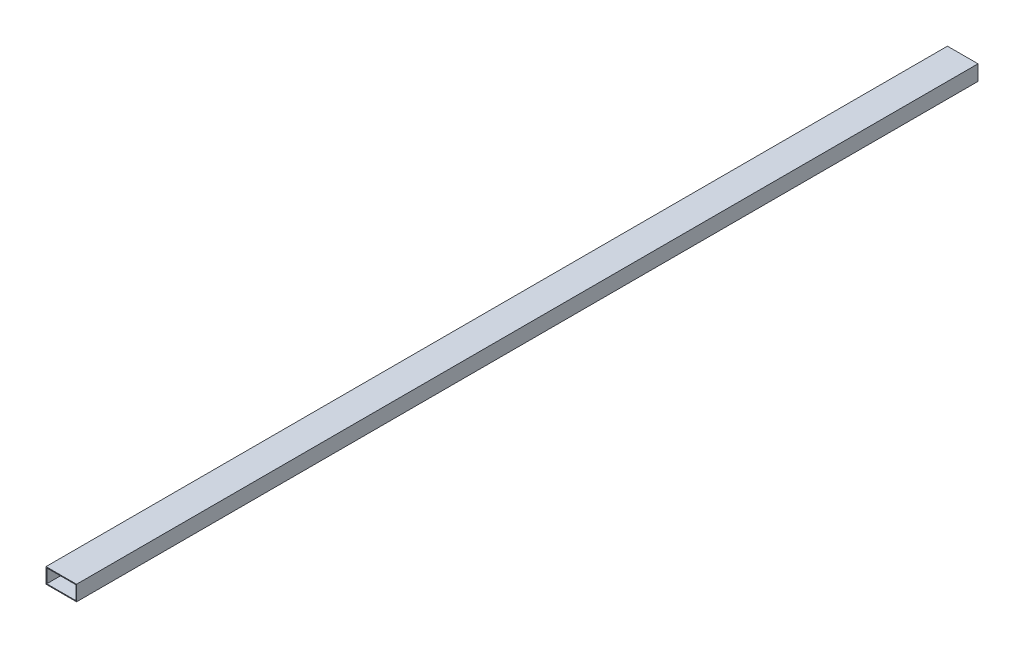
ISO-10303-21;
HEADER;
FILE_DESCRIPTION(('STEP AP214'),'2;1');
FILE_NAME('part.step','',(''),(''),'','','');
FILE_SCHEMA(('AUTOMOTIVE_DESIGN { 1 0 10303 214 1 1 1 1 }'));
ENDSEC;
DATA;
#1=APPLICATION_CONTEXT('core data for automotive mechanical design processes');
#2=APPLICATION_PROTOCOL_DEFINITION('international standard','automotive_design',2000,#1);
#3=PRODUCT_CONTEXT('',#1,'mechanical');
#4=PRODUCT('Part','Part','',(#3));
#5=PRODUCT_RELATED_PRODUCT_CATEGORY('part','',(#4));
#6=PRODUCT_DEFINITION_FORMATION('','',#4);
#7=PRODUCT_DEFINITION_CONTEXT('part definition',#1,'design');
#8=PRODUCT_DEFINITION('design','',#6,#7);
#9=PRODUCT_DEFINITION_SHAPE('','',#8);
#10=(LENGTH_UNIT() NAMED_UNIT(*) SI_UNIT(.MILLI.,.METRE.));
#11=(NAMED_UNIT(*) PLANE_ANGLE_UNIT() SI_UNIT($,.RADIAN.));
#12=(NAMED_UNIT(*) SI_UNIT($,.STERADIAN.) SOLID_ANGLE_UNIT());
#13=UNCERTAINTY_MEASURE_WITH_UNIT(LENGTH_MEASURE(1.E-05),#10,'distance_accuracy_value','');
#14=(GEOMETRIC_REPRESENTATION_CONTEXT(3) GLOBAL_UNCERTAINTY_ASSIGNED_CONTEXT((#13)) GLOBAL_UNIT_ASSIGNED_CONTEXT((#10,
#11,#12)) REPRESENTATION_CONTEXT('',''));
#15=CARTESIAN_POINT('',(0.,0.,0.));
#16=DIRECTION('',(0.,0.,1.));
#17=DIRECTION('',(1.,0.,0.));
#18=AXIS2_PLACEMENT_3D('',#15,#16,#17);
#19=CARTESIAN_POINT('',(0.,0.,1180.));
#20=DIRECTION('',(0.,0.,-1.));
#21=DIRECTION('',(-1.,0.,0.));
#22=AXIS2_PLACEMENT_3D('',#19,#20,#21);
#23=PLANE('',#22);
#24=DIRECTION('',(0.,-1.,0.));
#25=VECTOR('',#24,1.);
#26=CARTESIAN_POINT('',(0.,0.,1180.));
#27=LINE('',#26,#25);
#28=CARTESIAN_POINT('',(0.,20.,1180.));
#29=VERTEX_POINT('',#28);
#30=CARTESIAN_POINT('',(0.,0.,1180.));
#31=VERTEX_POINT('',#30);
#32=EDGE_CURVE('E136',#29,#31,#27,.T.);
#33=ORIENTED_EDGE('',*,*,#32,.T.);
#34=DIRECTION('',(1.,0.,0.));
#35=VECTOR('',#34,1.);
#36=CARTESIAN_POINT('',(0.,0.,1180.));
#37=LINE('',#36,#35);
#38=CARTESIAN_POINT('',(40.,0.,1180.));
#39=VERTEX_POINT('',#38);
#40=EDGE_CURVE('E139',#31,#39,#37,.T.);
#41=ORIENTED_EDGE('',*,*,#40,.T.);
#42=DIRECTION('',(0.,1.,0.));
#43=VECTOR('',#42,1.);
#44=CARTESIAN_POINT('',(40.,0.,1180.));
#45=LINE('',#44,#43);
#46=CARTESIAN_POINT('',(40.,20.,1180.));
#47=VERTEX_POINT('',#46);
#48=EDGE_CURVE('E142',#39,#47,#45,.T.);
#49=ORIENTED_EDGE('',*,*,#48,.T.);
#50=DIRECTION('',(-1.,0.,0.));
#51=VECTOR('',#50,1.);
#52=CARTESIAN_POINT('',(0.,20.,1180.));
#53=LINE('',#52,#51);
#54=EDGE_CURVE('E144',#47,#29,#53,.T.);
#55=ORIENTED_EDGE('',*,*,#54,.T.);
#56=EDGE_LOOP('',(#33,#41,#49,#55));
#57=FACE_BOUND('',#56,.T.);
#58=DIRECTION('',(0.,-1.,0.));
#59=VECTOR('',#58,1.);
#60=CARTESIAN_POINT('',(1.,1.,1180.));
#61=LINE('',#60,#59);
#62=CARTESIAN_POINT('',(1.,19.,1180.));
#63=VERTEX_POINT('',#62);
#64=CARTESIAN_POINT('',(1.,1.,1180.));
#65=VERTEX_POINT('',#64);
#66=EDGE_CURVE('E100',#63,#65,#61,.T.);
#67=ORIENTED_EDGE('',*,*,#66,.F.);
#68=DIRECTION('',(-1.,0.,0.));
#69=VECTOR('',#68,1.);
#70=CARTESIAN_POINT('',(1.,19.,1180.));
#71=LINE('',#70,#69);
#72=CARTESIAN_POINT('',(39.,19.,1180.));
#73=VERTEX_POINT('',#72);
#74=EDGE_CURVE('E122',#73,#63,#71,.T.);
#75=ORIENTED_EDGE('',*,*,#74,.F.);
#76=DIRECTION('',(0.,1.,0.));
#77=VECTOR('',#76,1.);
#78=CARTESIAN_POINT('',(39.,1.,1180.));
#79=LINE('',#78,#77);
#80=CARTESIAN_POINT('',(39.,1.,1180.));
#81=VERTEX_POINT('',#80);
#82=EDGE_CURVE('E120',#81,#73,#79,.T.);
#83=ORIENTED_EDGE('',*,*,#82,.F.);
#84=DIRECTION('',(1.,0.,0.));
#85=VECTOR('',#84,1.);
#86=CARTESIAN_POINT('',(1.,1.,1180.));
#87=LINE('',#86,#85);
#88=EDGE_CURVE('E108',#65,#81,#87,.T.);
#89=ORIENTED_EDGE('',*,*,#88,.F.);
#90=EDGE_LOOP('',(#67,#75,#83,#89));
#91=FACE_BOUND('',#90,.T.);
#92=ADVANCED_FACE('F35',(#57,#91),#23,.F.);
#93=CARTESIAN_POINT('',(0.,0.,0.));
#94=DIRECTION('',(0.,0.,-1.));
#95=DIRECTION('',(-1.,0.,0.));
#96=AXIS2_PLACEMENT_3D('',#93,#94,#95);
#97=PLANE('',#96);
#98=DIRECTION('',(0.,-1.,0.));
#99=VECTOR('',#98,1.);
#100=CARTESIAN_POINT('',(0.,0.,0.));
#101=LINE('',#100,#99);
#102=CARTESIAN_POINT('',(0.,20.,0.));
#103=VERTEX_POINT('',#102);
#104=CARTESIAN_POINT('',(0.,0.,0.));
#105=VERTEX_POINT('',#104);
#106=EDGE_CURVE('E116',#103,#105,#101,.T.);
#107=ORIENTED_EDGE('',*,*,#106,.F.);
#108=DIRECTION('',(-1.,0.,0.));
#109=VECTOR('',#108,1.);
#110=CARTESIAN_POINT('',(0.,20.,0.));
#111=LINE('',#110,#109);
#112=CARTESIAN_POINT('',(40.,20.,0.));
#113=VERTEX_POINT('',#112);
#114=EDGE_CURVE('E140',#113,#103,#111,.T.);
#115=ORIENTED_EDGE('',*,*,#114,.F.);
#116=DIRECTION('',(0.,1.,0.));
#117=VECTOR('',#116,1.);
#118=CARTESIAN_POINT('',(40.,0.,0.));
#119=LINE('',#118,#117);
#120=CARTESIAN_POINT('',(40.,0.,0.));
#121=VERTEX_POINT('',#120);
#122=EDGE_CURVE('E151',#121,#113,#119,.T.);
#123=ORIENTED_EDGE('',*,*,#122,.F.);
#124=DIRECTION('',(1.,0.,0.));
#125=VECTOR('',#124,1.);
#126=CARTESIAN_POINT('',(0.,0.,0.));
#127=LINE('',#126,#125);
#128=EDGE_CURVE('E149',#105,#121,#127,.T.);
#129=ORIENTED_EDGE('',*,*,#128,.F.);
#130=EDGE_LOOP('',(#107,#115,#123,#129));
#131=FACE_BOUND('',#130,.T.);
#132=DIRECTION('',(-1.,0.,0.));
#133=VECTOR('',#132,1.);
#134=CARTESIAN_POINT('',(1.,19.,0.));
#135=LINE('',#134,#133);
#136=CARTESIAN_POINT('',(39.,19.,0.));
#137=VERTEX_POINT('',#136);
#138=CARTESIAN_POINT('',(1.,19.,0.));
#139=VERTEX_POINT('',#138);
#140=EDGE_CURVE('E109',#137,#139,#135,.T.);
#141=ORIENTED_EDGE('',*,*,#140,.T.);
#142=DIRECTION('',(0.,-1.,0.));
#143=VECTOR('',#142,1.);
#144=CARTESIAN_POINT('',(1.,1.,0.));
#145=LINE('',#144,#143);
#146=CARTESIAN_POINT('',(1.,1.,0.));
#147=VERTEX_POINT('',#146);
#148=EDGE_CURVE('E58',#139,#147,#145,.T.);
#149=ORIENTED_EDGE('',*,*,#148,.T.);
#150=DIRECTION('',(1.,0.,0.));
#151=VECTOR('',#150,1.);
#152=CARTESIAN_POINT('',(1.,1.,0.));
#153=LINE('',#152,#151);
#154=CARTESIAN_POINT('',(39.,1.,0.));
#155=VERTEX_POINT('',#154);
#156=EDGE_CURVE('E115',#147,#155,#153,.T.);
#157=ORIENTED_EDGE('',*,*,#156,.T.);
#158=DIRECTION('',(0.,1.,0.));
#159=VECTOR('',#158,1.);
#160=CARTESIAN_POINT('',(39.,1.,0.));
#161=LINE('',#160,#159);
#162=EDGE_CURVE('E128',#155,#137,#161,.T.);
#163=ORIENTED_EDGE('',*,*,#162,.T.);
#164=EDGE_LOOP('',(#141,#149,#157,#163));
#165=FACE_BOUND('',#164,.T.);
#166=ADVANCED_FACE('F169',(#131,#165),#97,.T.);
#167=CARTESIAN_POINT('',(0.,0.,1180.));
#168=DIRECTION('',(1.,0.,0.));
#169=DIRECTION('',(0.,0.,-1.));
#170=AXIS2_PLACEMENT_3D('',#167,#168,#169);
#171=PLANE('',#170);
#172=ORIENTED_EDGE('',*,*,#106,.T.);
#173=DIRECTION('',(0.,0.,-1.));
#174=VECTOR('',#173,1.);
#175=CARTESIAN_POINT('',(0.,0.,1180.));
#176=LINE('',#175,#174);
#177=EDGE_CURVE('E11',#31,#105,#176,.T.);
#178=ORIENTED_EDGE('',*,*,#177,.F.);
#179=ORIENTED_EDGE('',*,*,#32,.F.);
#180=DIRECTION('',(0.,0.,-1.));
#181=VECTOR('',#180,1.);
#182=CARTESIAN_POINT('',(0.,20.,1180.));
#183=LINE('',#182,#181);
#184=EDGE_CURVE('E146',#29,#103,#183,.T.);
#185=ORIENTED_EDGE('',*,*,#184,.T.);
#186=EDGE_LOOP('',(#172,#178,#179,#185));
#187=FACE_BOUND('',#186,.T.);
#188=ADVANCED_FACE('F37',(#187),#171,.F.);
#189=CARTESIAN_POINT('',(0.,0.,1180.));
#190=DIRECTION('',(0.,1.,0.));
#191=DIRECTION('',(0.,0.,1.));
#192=AXIS2_PLACEMENT_3D('',#189,#190,#191);
#193=PLANE('',#192);
#194=ORIENTED_EDGE('',*,*,#128,.T.);
#195=DIRECTION('',(0.,0.,-1.));
#196=VECTOR('',#195,1.);
#197=CARTESIAN_POINT('',(40.,0.,1180.));
#198=LINE('',#197,#196);
#199=EDGE_CURVE('E43',#39,#121,#198,.T.);
#200=ORIENTED_EDGE('',*,*,#199,.F.);
#201=ORIENTED_EDGE('',*,*,#40,.F.);
#202=ORIENTED_EDGE('',*,*,#177,.T.);
#203=EDGE_LOOP('',(#194,#200,#201,#202));
#204=FACE_BOUND('',#203,.T.);
#205=ADVANCED_FACE('F179',(#204),#193,.F.);
#206=CARTESIAN_POINT('',(40.,0.,1180.));
#207=DIRECTION('',(-1.,0.,0.));
#208=DIRECTION('',(0.,0.,1.));
#209=AXIS2_PLACEMENT_3D('',#206,#207,#208);
#210=PLANE('',#209);
#211=ORIENTED_EDGE('',*,*,#122,.T.);
#212=DIRECTION('',(0.,0.,-1.));
#213=VECTOR('',#212,1.);
#214=CARTESIAN_POINT('',(40.,20.,1180.));
#215=LINE('',#214,#213);
#216=EDGE_CURVE('E156',#47,#113,#215,.T.);
#217=ORIENTED_EDGE('',*,*,#216,.F.);
#218=ORIENTED_EDGE('',*,*,#48,.F.);
#219=ORIENTED_EDGE('',*,*,#199,.T.);
#220=EDGE_LOOP('',(#211,#217,#218,#219));
#221=FACE_BOUND('',#220,.T.);
#222=ADVANCED_FACE('F163',(#221),#210,.F.);
#223=CARTESIAN_POINT('',(0.,20.,1180.));
#224=DIRECTION('',(0.,-1.,0.));
#225=DIRECTION('',(0.,0.,-1.));
#226=AXIS2_PLACEMENT_3D('',#223,#224,#225);
#227=PLANE('',#226);
#228=ORIENTED_EDGE('',*,*,#114,.T.);
#229=ORIENTED_EDGE('',*,*,#184,.F.);
#230=ORIENTED_EDGE('',*,*,#54,.F.);
#231=ORIENTED_EDGE('',*,*,#216,.T.);
#232=EDGE_LOOP('',(#228,#229,#230,#231));
#233=FACE_BOUND('',#232,.T.);
#234=ADVANCED_FACE('F173',(#233),#227,.F.);
#235=CARTESIAN_POINT('',(1.,1.,1180.));
#236=DIRECTION('',(1.,0.,0.));
#237=DIRECTION('',(0.,0.,-1.));
#238=AXIS2_PLACEMENT_3D('',#235,#236,#237);
#239=PLANE('',#238);
#240=ORIENTED_EDGE('',*,*,#148,.F.);
#241=DIRECTION('',(0.,0.,-1.));
#242=VECTOR('',#241,1.);
#243=CARTESIAN_POINT('',(1.,19.,1180.));
#244=LINE('',#243,#242);
#245=EDGE_CURVE('E104',#63,#139,#244,.T.);
#246=ORIENTED_EDGE('',*,*,#245,.F.);
#247=ORIENTED_EDGE('',*,*,#66,.T.);
#248=DIRECTION('',(0.,0.,-1.));
#249=VECTOR('',#248,1.);
#250=CARTESIAN_POINT('',(1.,1.,1180.));
#251=LINE('',#250,#249);
#252=EDGE_CURVE('E103',#65,#147,#251,.T.);
#253=ORIENTED_EDGE('',*,*,#252,.T.);
#254=EDGE_LOOP('',(#240,#246,#247,#253));
#255=FACE_BOUND('',#254,.T.);
#256=ADVANCED_FACE('F102',(#255),#239,.T.);
#257=CARTESIAN_POINT('',(1.,1.,1180.));
#258=DIRECTION('',(0.,1.,0.));
#259=DIRECTION('',(0.,0.,1.));
#260=AXIS2_PLACEMENT_3D('',#257,#258,#259);
#261=PLANE('',#260);
#262=ORIENTED_EDGE('',*,*,#156,.F.);
#263=ORIENTED_EDGE('',*,*,#252,.F.);
#264=ORIENTED_EDGE('',*,*,#88,.T.);
#265=DIRECTION('',(0.,0.,-1.));
#266=VECTOR('',#265,1.);
#267=CARTESIAN_POINT('',(39.,1.,1180.));
#268=LINE('',#267,#266);
#269=EDGE_CURVE('E117',#81,#155,#268,.T.);
#270=ORIENTED_EDGE('',*,*,#269,.T.);
#271=EDGE_LOOP('',(#262,#263,#264,#270));
#272=FACE_BOUND('',#271,.T.);
#273=ADVANCED_FACE('F112',(#272),#261,.T.);
#274=CARTESIAN_POINT('',(39.,1.,1180.));
#275=DIRECTION('',(-1.,0.,0.));
#276=DIRECTION('',(0.,0.,1.));
#277=AXIS2_PLACEMENT_3D('',#274,#275,#276);
#278=PLANE('',#277);
#279=ORIENTED_EDGE('',*,*,#162,.F.);
#280=ORIENTED_EDGE('',*,*,#269,.F.);
#281=ORIENTED_EDGE('',*,*,#82,.T.);
#282=DIRECTION('',(0.,0.,-1.));
#283=VECTOR('',#282,1.);
#284=CARTESIAN_POINT('',(39.,19.,1180.));
#285=LINE('',#284,#283);
#286=EDGE_CURVE('E50',#73,#137,#285,.T.);
#287=ORIENTED_EDGE('',*,*,#286,.T.);
#288=EDGE_LOOP('',(#279,#280,#281,#287));
#289=FACE_BOUND('',#288,.T.);
#290=ADVANCED_FACE('F202',(#289),#278,.T.);
#291=CARTESIAN_POINT('',(1.,19.,1180.));
#292=DIRECTION('',(0.,-1.,0.));
#293=DIRECTION('',(0.,0.,-1.));
#294=AXIS2_PLACEMENT_3D('',#291,#292,#293);
#295=PLANE('',#294);
#296=ORIENTED_EDGE('',*,*,#140,.F.);
#297=ORIENTED_EDGE('',*,*,#286,.F.);
#298=ORIENTED_EDGE('',*,*,#74,.T.);
#299=ORIENTED_EDGE('',*,*,#245,.T.);
#300=EDGE_LOOP('',(#296,#297,#298,#299));
#301=FACE_BOUND('',#300,.T.);
#302=ADVANCED_FACE('F206',(#301),#295,.T.);
#303=CLOSED_SHELL('',(#92,#166,#188,#205,#222,#234,#256,#273,#290,#302));
#304=MANIFOLD_SOLID_BREP('B2',#303);
#305=ADVANCED_BREP_SHAPE_REPRESENTATION('',(#18,#304),#14);
#306=SHAPE_DEFINITION_REPRESENTATION(#9,#305);
ENDSEC;
END-ISO-10303-21;
